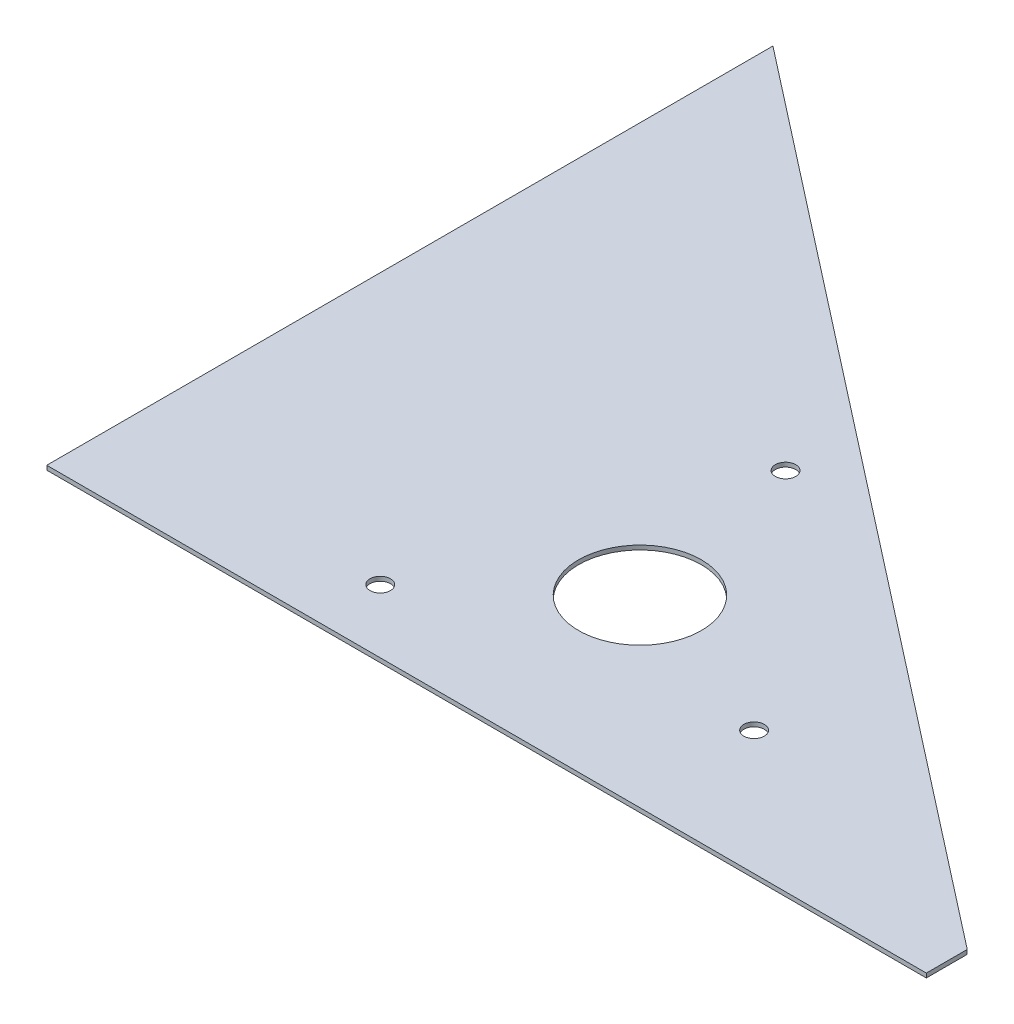
ISO-10303-21;
HEADER;
FILE_DESCRIPTION(('STEP AP214'),'2;1');
FILE_NAME('part.step','',(''),(''),'','','');
FILE_SCHEMA(('AUTOMOTIVE_DESIGN { 1 0 10303 214 1 1 1 1 }'));
ENDSEC;
DATA;
#1=APPLICATION_CONTEXT('core data for automotive mechanical design processes');
#2=APPLICATION_PROTOCOL_DEFINITION('international standard','automotive_design',2000,#1);
#3=PRODUCT_CONTEXT('',#1,'mechanical');
#4=PRODUCT('Part','Part','',(#3));
#5=PRODUCT_RELATED_PRODUCT_CATEGORY('part','',(#4));
#6=PRODUCT_DEFINITION_FORMATION('','',#4);
#7=PRODUCT_DEFINITION_CONTEXT('part definition',#1,'design');
#8=PRODUCT_DEFINITION('design','',#6,#7);
#9=PRODUCT_DEFINITION_SHAPE('','',#8);
#10=(LENGTH_UNIT() NAMED_UNIT(*) SI_UNIT(.MILLI.,.METRE.));
#11=(NAMED_UNIT(*) PLANE_ANGLE_UNIT() SI_UNIT($,.RADIAN.));
#12=(NAMED_UNIT(*) SI_UNIT($,.STERADIAN.) SOLID_ANGLE_UNIT());
#13=UNCERTAINTY_MEASURE_WITH_UNIT(LENGTH_MEASURE(1.E-05),#10,'distance_accuracy_value','');
#14=(GEOMETRIC_REPRESENTATION_CONTEXT(3) GLOBAL_UNCERTAINTY_ASSIGNED_CONTEXT((#13)) GLOBAL_UNIT_ASSIGNED_CONTEXT((#10,
#11,#12)) REPRESENTATION_CONTEXT('',''));
#15=CARTESIAN_POINT('',(0.,0.,0.));
#16=DIRECTION('',(0.,0.,1.));
#17=DIRECTION('',(1.,0.,0.));
#18=AXIS2_PLACEMENT_3D('',#15,#16,#17);
#19=CARTESIAN_POINT('',(546.1,2.65684,-25.4));
#20=DIRECTION('',(-0.614575452616154,0.,0.788858043656556));
#21=DIRECTION('',(0.788858043656556,0.,0.614575452616154));
#22=AXIS2_PLACEMENT_3D('',#19,#20,#21);
#23=PLANE('',#22);
#24=DIRECTION('',(-0.788858043656556,0.,-0.614575452616154));
#25=VECTOR('',#24,1.);
#26=CARTESIAN_POINT('',(546.1,0.,-25.4));
#27=LINE('',#26,#25);
#28=CARTESIAN_POINT('',(546.1,0.,-25.4));
#29=VERTEX_POINT('',#28);
#30=CARTESIAN_POINT('',(0.,0.,-450.85));
#31=VERTEX_POINT('',#30);
#32=EDGE_CURVE('E95',#29,#31,#27,.T.);
#33=ORIENTED_EDGE('',*,*,#32,.T.);
#34=DIRECTION('',(0.,-1.,0.));
#35=VECTOR('',#34,1.);
#36=CARTESIAN_POINT('',(0.,2.65684,-450.85));
#37=LINE('',#36,#35);
#38=CARTESIAN_POINT('',(0.,2.65684,-450.85));
#39=VERTEX_POINT('',#38);
#40=EDGE_CURVE('E11',#39,#31,#37,.T.);
#41=ORIENTED_EDGE('',*,*,#40,.F.);
#42=DIRECTION('',(-0.788858043656556,0.,-0.614575452616154));
#43=VECTOR('',#42,1.);
#44=CARTESIAN_POINT('',(546.1,2.65684,-25.4));
#45=LINE('',#44,#43);
#46=CARTESIAN_POINT('',(546.1,2.65684,-25.4));
#47=VERTEX_POINT('',#46);
#48=EDGE_CURVE('E83',#47,#39,#45,.T.);
#49=ORIENTED_EDGE('',*,*,#48,.F.);
#50=DIRECTION('',(0.,-1.,0.));
#51=VECTOR('',#50,1.);
#52=CARTESIAN_POINT('',(546.1,2.65684,-25.4));
#53=LINE('',#52,#51);
#54=EDGE_CURVE('E91',#47,#29,#53,.T.);
#55=ORIENTED_EDGE('',*,*,#54,.T.);
#56=EDGE_LOOP('',(#33,#41,#49,#55));
#57=FACE_BOUND('',#56,.T.);
#58=ADVANCED_FACE('F32',(#57),#23,.F.);
#59=CARTESIAN_POINT('',(0.,2.65684,-450.85));
#60=DIRECTION('',(1.,0.,0.));
#61=DIRECTION('',(0.,0.,-1.));
#62=AXIS2_PLACEMENT_3D('',#59,#60,#61);
#63=PLANE('',#62);
#64=DIRECTION('',(0.,0.,1.));
#65=VECTOR('',#64,1.);
#66=CARTESIAN_POINT('',(0.,0.,-450.85));
#67=LINE('',#66,#65);
#68=CARTESIAN_POINT('',(0.,0.,0.));
#69=VERTEX_POINT('',#68);
#70=EDGE_CURVE('E87',#31,#69,#67,.T.);
#71=ORIENTED_EDGE('',*,*,#70,.T.);
#72=DIRECTION('',(0.,-1.,0.));
#73=VECTOR('',#72,1.);
#74=CARTESIAN_POINT('',(0.,2.65684,0.));
#75=LINE('',#74,#73);
#76=CARTESIAN_POINT('',(0.,2.65684,0.));
#77=VERTEX_POINT('',#76);
#78=EDGE_CURVE('E40',#77,#69,#75,.T.);
#79=ORIENTED_EDGE('',*,*,#78,.F.);
#80=DIRECTION('',(0.,0.,1.));
#81=VECTOR('',#80,1.);
#82=CARTESIAN_POINT('',(0.,2.65684,-450.85));
#83=LINE('',#82,#81);
#84=EDGE_CURVE('E78',#39,#77,#83,.T.);
#85=ORIENTED_EDGE('',*,*,#84,.F.);
#86=ORIENTED_EDGE('',*,*,#40,.T.);
#87=EDGE_LOOP('',(#71,#79,#85,#86));
#88=FACE_BOUND('',#87,.T.);
#89=ADVANCED_FACE('F86',(#88),#63,.F.);
#90=CARTESIAN_POINT('',(0.,2.65684,0.));
#91=DIRECTION('',(0.,0.,-1.));
#92=DIRECTION('',(-1.,0.,0.));
#93=AXIS2_PLACEMENT_3D('',#90,#91,#92);
#94=PLANE('',#93);
#95=DIRECTION('',(1.,0.,0.));
#96=VECTOR('',#95,1.);
#97=CARTESIAN_POINT('',(0.,0.,0.));
#98=LINE('',#97,#96);
#99=CARTESIAN_POINT('',(546.1,0.,0.));
#100=VERTEX_POINT('',#99);
#101=EDGE_CURVE('E65',#69,#100,#98,.T.);
#102=ORIENTED_EDGE('',*,*,#101,.T.);
#103=DIRECTION('',(0.,-1.,0.));
#104=VECTOR('',#103,1.);
#105=CARTESIAN_POINT('',(546.1,2.65684,0.));
#106=LINE('',#105,#104);
#107=CARTESIAN_POINT('',(546.1,2.65684,0.));
#108=VERTEX_POINT('',#107);
#109=EDGE_CURVE('E88',#108,#100,#106,.T.);
#110=ORIENTED_EDGE('',*,*,#109,.F.);
#111=DIRECTION('',(1.,0.,0.));
#112=VECTOR('',#111,1.);
#113=CARTESIAN_POINT('',(0.,2.65684,0.));
#114=LINE('',#113,#112);
#115=EDGE_CURVE('E81',#77,#108,#114,.T.);
#116=ORIENTED_EDGE('',*,*,#115,.F.);
#117=ORIENTED_EDGE('',*,*,#78,.T.);
#118=EDGE_LOOP('',(#102,#110,#116,#117));
#119=FACE_BOUND('',#118,.T.);
#120=ADVANCED_FACE('F89',(#119),#94,.F.);
#121=CARTESIAN_POINT('',(546.1,2.65684,0.));
#122=DIRECTION('',(-1.,0.,0.));
#123=DIRECTION('',(0.,0.,1.));
#124=AXIS2_PLACEMENT_3D('',#121,#122,#123);
#125=PLANE('',#124);
#126=DIRECTION('',(0.,0.,-1.));
#127=VECTOR('',#126,1.);
#128=CARTESIAN_POINT('',(546.1,0.,0.));
#129=LINE('',#128,#127);
#130=EDGE_CURVE('E71',#100,#29,#129,.T.);
#131=ORIENTED_EDGE('',*,*,#130,.T.);
#132=ORIENTED_EDGE('',*,*,#54,.F.);
#133=DIRECTION('',(0.,0.,-1.));
#134=VECTOR('',#133,1.);
#135=CARTESIAN_POINT('',(546.1,2.65684,0.));
#136=LINE('',#135,#134);
#137=EDGE_CURVE('E48',#108,#47,#136,.T.);
#138=ORIENTED_EDGE('',*,*,#137,.F.);
#139=ORIENTED_EDGE('',*,*,#109,.T.);
#140=EDGE_LOOP('',(#131,#132,#138,#139));
#141=FACE_BOUND('',#140,.T.);
#142=ADVANCED_FACE('F103',(#141),#125,.F.);
#143=CARTESIAN_POINT('',(0.,2.65684,0.));
#144=DIRECTION('',(0.,1.,0.));
#145=DIRECTION('',(0.,0.,1.));
#146=AXIS2_PLACEMENT_3D('',#143,#144,#145);
#147=PLANE('',#146);
#148=CARTESIAN_POINT('',(232.190531828462,2.65684,-226.499987068068));
#149=DIRECTION('',(0.,1.,0.));
#150=DIRECTION('',(0.,0.,1.));
#151=AXIS2_PLACEMENT_3D('',#148,#149,#150);
#152=CIRCLE('',#151,6.34999999999998);
#153=CARTESIAN_POINT('',(232.190531828462,2.65684,-220.149987068068));
#154=VERTEX_POINT('',#153);
#155=EDGE_CURVE('E127',#154,#154,#152,.T.);
#156=ORIENTED_EDGE('',*,*,#155,.F.);
#157=EDGE_LOOP('',(#156));
#158=FACE_BOUND('',#157,.T.);
#159=CARTESIAN_POINT('',(167.736694980537,2.65684,-39.3124529863857));
#160=DIRECTION('',(0.,1.,0.));
#161=DIRECTION('',(0.,0.,1.));
#162=AXIS2_PLACEMENT_3D('',#159,#160,#161);
#163=CIRCLE('',#162,6.35000000000006);
#164=CARTESIAN_POINT('',(167.736694980537,2.65684,-32.9624529863856));
#165=VERTEX_POINT('',#164);
#166=EDGE_CURVE('E121',#165,#165,#163,.T.);
#167=ORIENTED_EDGE('',*,*,#166,.F.);
#168=EDGE_LOOP('',(#167));
#169=FACE_BOUND('',#168,.T.);
#170=CARTESIAN_POINT('',(362.072773191002,2.65684,-77.087559945547));
#171=DIRECTION('',(0.,1.,0.));
#172=DIRECTION('',(0.,0.,1.));
#173=AXIS2_PLACEMENT_3D('',#170,#171,#172);
#174=CIRCLE('',#173,6.35);
#175=CARTESIAN_POINT('',(362.072773191002,2.65684,-70.737559945547));
#176=VERTEX_POINT('',#175);
#177=EDGE_CURVE('E115',#176,#176,#174,.T.);
#178=ORIENTED_EDGE('',*,*,#177,.F.);
#179=EDGE_LOOP('',(#178));
#180=FACE_BOUND('',#179,.T.);
#181=CARTESIAN_POINT('',(254.,2.65684,-114.3));
#182=DIRECTION('',(0.,-1.,0.));
#183=DIRECTION('',(0.,0.,-1.));
#184=AXIS2_PLACEMENT_3D('',#181,#182,#183);
#185=CIRCLE('',#184,38.1);
#186=CARTESIAN_POINT('',(254.,2.65684,-152.4));
#187=VERTEX_POINT('',#186);
#188=EDGE_CURVE('E98',#187,#187,#185,.T.);
#189=ORIENTED_EDGE('',*,*,#188,.T.);
#190=EDGE_LOOP('',(#189));
#191=FACE_BOUND('',#190,.T.);
#192=ORIENTED_EDGE('',*,*,#48,.T.);
#193=ORIENTED_EDGE('',*,*,#84,.T.);
#194=ORIENTED_EDGE('',*,*,#115,.T.);
#195=ORIENTED_EDGE('',*,*,#137,.T.);
#196=EDGE_LOOP('',(#192,#193,#194,#195));
#197=FACE_BOUND('',#196,.T.);
#198=ADVANCED_FACE('F79',(#158,#169,#180,#191,#197),#147,.T.);
#199=CARTESIAN_POINT('',(0.,0.,0.));
#200=DIRECTION('',(0.,1.,0.));
#201=DIRECTION('',(0.,0.,1.));
#202=AXIS2_PLACEMENT_3D('',#199,#200,#201);
#203=PLANE('',#202);
#204=CARTESIAN_POINT('',(232.190531828462,0.,-226.499987068068));
#205=DIRECTION('',(0.,1.,0.));
#206=DIRECTION('',(0.,0.,1.));
#207=AXIS2_PLACEMENT_3D('',#204,#205,#206);
#208=CIRCLE('',#207,6.34999999999998);
#209=CARTESIAN_POINT('',(232.190531828462,0.,-220.149987068068));
#210=VERTEX_POINT('',#209);
#211=EDGE_CURVE('E124',#210,#210,#208,.T.);
#212=ORIENTED_EDGE('',*,*,#211,.T.);
#213=EDGE_LOOP('',(#212));
#214=FACE_BOUND('',#213,.T.);
#215=CARTESIAN_POINT('',(167.736694980537,0.,-39.3124529863857));
#216=DIRECTION('',(0.,1.,0.));
#217=DIRECTION('',(0.,0.,1.));
#218=AXIS2_PLACEMENT_3D('',#215,#216,#217);
#219=CIRCLE('',#218,6.35000000000006);
#220=CARTESIAN_POINT('',(167.736694980537,0.,-32.9624529863856));
#221=VERTEX_POINT('',#220);
#222=EDGE_CURVE('E118',#221,#221,#219,.T.);
#223=ORIENTED_EDGE('',*,*,#222,.T.);
#224=EDGE_LOOP('',(#223));
#225=FACE_BOUND('',#224,.T.);
#226=CARTESIAN_POINT('',(362.072773191002,0.,-77.087559945547));
#227=DIRECTION('',(0.,1.,0.));
#228=DIRECTION('',(0.,0.,1.));
#229=AXIS2_PLACEMENT_3D('',#226,#227,#228);
#230=CIRCLE('',#229,6.35);
#231=CARTESIAN_POINT('',(362.072773191002,0.,-70.737559945547));
#232=VERTEX_POINT('',#231);
#233=EDGE_CURVE('E112',#232,#232,#230,.T.);
#234=ORIENTED_EDGE('',*,*,#233,.T.);
#235=EDGE_LOOP('',(#234));
#236=FACE_BOUND('',#235,.T.);
#237=CARTESIAN_POINT('',(254.,0.,-114.3));
#238=DIRECTION('',(0.,-1.,0.));
#239=DIRECTION('',(0.,0.,-1.));
#240=AXIS2_PLACEMENT_3D('',#237,#238,#239);
#241=CIRCLE('',#240,38.1);
#242=CARTESIAN_POINT('',(254.,0.,-152.4));
#243=VERTEX_POINT('',#242);
#244=EDGE_CURVE('E109',#243,#243,#241,.T.);
#245=ORIENTED_EDGE('',*,*,#244,.F.);
#246=EDGE_LOOP('',(#245));
#247=FACE_BOUND('',#246,.T.);
#248=ORIENTED_EDGE('',*,*,#32,.F.);
#249=ORIENTED_EDGE('',*,*,#130,.F.);
#250=ORIENTED_EDGE('',*,*,#101,.F.);
#251=ORIENTED_EDGE('',*,*,#70,.F.);
#252=EDGE_LOOP('',(#248,#249,#250,#251));
#253=FACE_BOUND('',#252,.T.);
#254=ADVANCED_FACE('F106',(#214,#225,#236,#247,#253),#203,.F.);
#255=CARTESIAN_POINT('',(254.,2.65684,-114.3));
#256=DIRECTION('',(0.,-1.,0.));
#257=DIRECTION('',(0.,0.,-1.));
#258=AXIS2_PLACEMENT_3D('',#255,#256,#257);
#259=CYLINDRICAL_SURFACE('',#258,38.1);
#260=CARTESIAN_POINT('',(254.,2.65684,-152.4));
#261=CARTESIAN_POINT('',(254.,2.62916458333333,-152.4));
#262=CARTESIAN_POINT('',(254.,2.60148916666667,-152.4));
#263=CARTESIAN_POINT('',(254.,2.54613833333333,-152.4));
#264=CARTESIAN_POINT('',(254.,2.51846291666667,-152.4));
#265=CARTESIAN_POINT('',(254.,2.46311208333333,-152.4));
#266=CARTESIAN_POINT('',(254.,2.43543666666667,-152.4));
#267=CARTESIAN_POINT('',(254.,2.38008583333333,-152.4));
#268=CARTESIAN_POINT('',(254.,2.35241041666667,-152.4));
#269=CARTESIAN_POINT('',(254.,2.29705958333333,-152.4));
#270=CARTESIAN_POINT('',(254.,2.26938416666667,-152.4));
#271=CARTESIAN_POINT('',(254.,2.21403333333333,-152.4));
#272=CARTESIAN_POINT('',(254.,2.18635791666667,-152.4));
#273=CARTESIAN_POINT('',(254.,2.13100708333333,-152.4));
#274=CARTESIAN_POINT('',(254.,2.10333166666667,-152.4));
#275=CARTESIAN_POINT('',(254.,2.04798083333333,-152.4));
#276=CARTESIAN_POINT('',(254.,2.02030541666667,-152.4));
#277=CARTESIAN_POINT('',(254.,1.96495458333333,-152.4));
#278=CARTESIAN_POINT('',(254.,1.93727916666667,-152.4));
#279=CARTESIAN_POINT('',(254.,1.88192833333333,-152.4));
#280=CARTESIAN_POINT('',(254.,1.85425291666667,-152.4));
#281=CARTESIAN_POINT('',(254.,1.79890208333333,-152.4));
#282=CARTESIAN_POINT('',(254.,1.77122666666667,-152.4));
#283=CARTESIAN_POINT('',(254.,1.71587583333333,-152.4));
#284=CARTESIAN_POINT('',(254.,1.68820041666667,-152.4));
#285=CARTESIAN_POINT('',(254.,1.63284958333333,-152.4));
#286=CARTESIAN_POINT('',(254.,1.60517416666667,-152.4));
#287=CARTESIAN_POINT('',(254.,1.54982333333333,-152.4));
#288=CARTESIAN_POINT('',(254.,1.52214791666667,-152.4));
#289=CARTESIAN_POINT('',(254.,1.46679708333333,-152.4));
#290=CARTESIAN_POINT('',(254.,1.43912166666667,-152.4));
#291=CARTESIAN_POINT('',(254.,1.38377083333333,-152.4));
#292=CARTESIAN_POINT('',(254.,1.35609541666667,-152.4));
#293=CARTESIAN_POINT('',(254.,1.30074458333333,-152.4));
#294=CARTESIAN_POINT('',(254.,1.27306916666667,-152.4));
#295=CARTESIAN_POINT('',(254.,1.21771833333333,-152.4));
#296=CARTESIAN_POINT('',(254.,1.19004291666667,-152.4));
#297=CARTESIAN_POINT('',(254.,1.13469208333333,-152.4));
#298=CARTESIAN_POINT('',(254.,1.10701666666667,-152.4));
#299=CARTESIAN_POINT('',(254.,1.05166583333333,-152.4));
#300=CARTESIAN_POINT('',(254.,1.02399041666667,-152.4));
#301=CARTESIAN_POINT('',(254.,0.968639583333333,-152.4));
#302=CARTESIAN_POINT('',(254.,0.940964166666667,-152.4));
#303=CARTESIAN_POINT('',(254.,0.885613333333333,-152.4));
#304=CARTESIAN_POINT('',(254.,0.857937916666667,-152.4));
#305=CARTESIAN_POINT('',(254.,0.802587083333333,-152.4));
#306=CARTESIAN_POINT('',(254.,0.774911666666667,-152.4));
#307=CARTESIAN_POINT('',(254.,0.719560833333334,-152.4));
#308=CARTESIAN_POINT('',(254.,0.691885416666667,-152.4));
#309=CARTESIAN_POINT('',(254.,0.636534583333334,-152.4));
#310=CARTESIAN_POINT('',(254.,0.608859166666667,-152.4));
#311=CARTESIAN_POINT('',(254.,0.553508333333334,-152.4));
#312=CARTESIAN_POINT('',(254.,0.525832916666667,-152.4));
#313=CARTESIAN_POINT('',(254.,0.470482083333334,-152.4));
#314=CARTESIAN_POINT('',(254.,0.442806666666667,-152.4));
#315=CARTESIAN_POINT('',(254.,0.387455833333334,-152.4));
#316=CARTESIAN_POINT('',(254.,0.359780416666667,-152.4));
#317=CARTESIAN_POINT('',(254.,0.304429583333334,-152.4));
#318=CARTESIAN_POINT('',(254.,0.276754166666667,-152.4));
#319=CARTESIAN_POINT('',(254.,0.221403333333334,-152.4));
#320=CARTESIAN_POINT('',(254.,0.193727916666667,-152.4));
#321=CARTESIAN_POINT('',(254.,0.138377083333334,-152.4));
#322=CARTESIAN_POINT('',(254.,0.110701666666667,-152.4));
#323=CARTESIAN_POINT('',(254.,0.0553508333333336,-152.4));
#324=CARTESIAN_POINT('',(254.,0.027675416666667,-152.4));
#325=CARTESIAN_POINT('',(254.,0.,-152.4));
#326=B_SPLINE_CURVE_WITH_KNOTS('',3,(#260,#261,#262,#263,#264,#265,#266,#267,#268,#269,#270,
#271,#272,#273,#274,#275,#276,#277,#278,#279,#280,#281,#282,#283,#284,#285,#286,#287,#288,#289,
#290,#291,#292,#293,#294,#295,#296,#297,#298,#299,#300,#301,#302,#303,#304,#305,#306,#307,#308,
#309,#310,#311,#312,#313,#314,#315,#316,#317,#318,#319,#320,#321,#322,#323,#324,#325),
.UNSPECIFIED.,.F.,.F.,(4,2,2,2,2,2,2,2,2,2,2,2,2,2,2,2,2,2,2,2,2,2,2,2,2,2,2,2,2,2,2,2,4),(0.,
0.0830262500000002,0.1660525,0.24907875,0.332105,0.41513125,0.4981575,0.58118375,0.66421,
0.74723625,0.8302625,0.91328875,0.996315,1.07934125,1.1623675,1.24539375,1.32842,1.41144625,
1.4944725,1.57749875,1.660525,1.74355125,1.8265775,1.90960375,1.99263,2.07565625,2.1586825,
2.24170875,2.324735,2.40776125,2.4907875,2.57381375,2.65684),.UNSPECIFIED.);
#327=EDGE_CURVE('BSEAM151',#187,#243,#326,.T.);
#328=ORIENTED_EDGE('',*,*,#188,.F.);
#329=ORIENTED_EDGE('',*,*,#244,.T.);
#330=ORIENTED_EDGE('',*,*,#327,.T.);
#331=ORIENTED_EDGE('',*,*,#327,.F.);
#332=EDGE_LOOP('',(#328,#330,#329,#331));
#333=FACE_BOUND('',#332,.T.);
#334=ADVANCED_FACE('F151',(#333),#259,.F.);
#335=CARTESIAN_POINT('',(362.072773191002,0.,-77.087559945547));
#336=DIRECTION('',(0.,1.,0.));
#337=DIRECTION('',(0.,0.,1.));
#338=AXIS2_PLACEMENT_3D('',#335,#336,#337);
#339=CYLINDRICAL_SURFACE('',#338,6.35);
#340=CARTESIAN_POINT('',(362.072773191002,0.,-70.737559945547));
#341=CARTESIAN_POINT('',(362.072773191002,0.0276754166666666,-70.737559945547));
#342=CARTESIAN_POINT('',(362.072773191002,0.0553508333333333,-70.737559945547));
#343=CARTESIAN_POINT('',(362.072773191002,0.110701666666667,-70.737559945547));
#344=CARTESIAN_POINT('',(362.072773191002,0.138377083333333,-70.737559945547));
#345=CARTESIAN_POINT('',(362.072773191002,0.193727916666667,-70.737559945547));
#346=CARTESIAN_POINT('',(362.072773191002,0.221403333333333,-70.737559945547));
#347=CARTESIAN_POINT('',(362.072773191002,0.276754166666667,-70.737559945547));
#348=CARTESIAN_POINT('',(362.072773191002,0.304429583333333,-70.737559945547));
#349=CARTESIAN_POINT('',(362.072773191002,0.359780416666667,-70.737559945547));
#350=CARTESIAN_POINT('',(362.072773191002,0.387455833333333,-70.737559945547));
#351=CARTESIAN_POINT('',(362.072773191002,0.442806666666667,-70.737559945547));
#352=CARTESIAN_POINT('',(362.072773191002,0.470482083333333,-70.737559945547));
#353=CARTESIAN_POINT('',(362.072773191002,0.525832916666666,-70.737559945547));
#354=CARTESIAN_POINT('',(362.072773191002,0.553508333333333,-70.737559945547));
#355=CARTESIAN_POINT('',(362.072773191002,0.608859166666667,-70.737559945547));
#356=CARTESIAN_POINT('',(362.072773191002,0.636534583333333,-70.737559945547));
#357=CARTESIAN_POINT('',(362.072773191002,0.691885416666666,-70.737559945547));
#358=CARTESIAN_POINT('',(362.072773191002,0.719560833333333,-70.737559945547));
#359=CARTESIAN_POINT('',(362.072773191002,0.774911666666667,-70.737559945547));
#360=CARTESIAN_POINT('',(362.072773191002,0.802587083333333,-70.737559945547));
#361=CARTESIAN_POINT('',(362.072773191002,0.857937916666667,-70.737559945547));
#362=CARTESIAN_POINT('',(362.072773191002,0.885613333333333,-70.737559945547));
#363=CARTESIAN_POINT('',(362.072773191002,0.940964166666666,-70.737559945547));
#364=CARTESIAN_POINT('',(362.072773191002,0.968639583333333,-70.737559945547));
#365=CARTESIAN_POINT('',(362.072773191002,1.02399041666667,-70.737559945547));
#366=CARTESIAN_POINT('',(362.072773191002,1.05166583333333,-70.737559945547));
#367=CARTESIAN_POINT('',(362.072773191002,1.10701666666667,-70.737559945547));
#368=CARTESIAN_POINT('',(362.072773191002,1.13469208333333,-70.737559945547));
#369=CARTESIAN_POINT('',(362.072773191002,1.19004291666667,-70.737559945547));
#370=CARTESIAN_POINT('',(362.072773191002,1.21771833333333,-70.737559945547));
#371=CARTESIAN_POINT('',(362.072773191002,1.27306916666667,-70.737559945547));
#372=CARTESIAN_POINT('',(362.072773191002,1.30074458333333,-70.737559945547));
#373=CARTESIAN_POINT('',(362.072773191002,1.35609541666667,-70.737559945547));
#374=CARTESIAN_POINT('',(362.072773191002,1.38377083333333,-70.737559945547));
#375=CARTESIAN_POINT('',(362.072773191002,1.43912166666667,-70.737559945547));
#376=CARTESIAN_POINT('',(362.072773191002,1.46679708333333,-70.737559945547));
#377=CARTESIAN_POINT('',(362.072773191002,1.52214791666667,-70.737559945547));
#378=CARTESIAN_POINT('',(362.072773191002,1.54982333333333,-70.737559945547));
#379=CARTESIAN_POINT('',(362.072773191002,1.60517416666667,-70.737559945547));
#380=CARTESIAN_POINT('',(362.072773191002,1.63284958333333,-70.737559945547));
#381=CARTESIAN_POINT('',(362.072773191002,1.68820041666667,-70.737559945547));
#382=CARTESIAN_POINT('',(362.072773191002,1.71587583333333,-70.737559945547));
#383=CARTESIAN_POINT('',(362.072773191002,1.77122666666667,-70.737559945547));
#384=CARTESIAN_POINT('',(362.072773191002,1.79890208333333,-70.737559945547));
#385=CARTESIAN_POINT('',(362.072773191002,1.85425291666667,-70.737559945547));
#386=CARTESIAN_POINT('',(362.072773191002,1.88192833333333,-70.737559945547));
#387=CARTESIAN_POINT('',(362.072773191002,1.93727916666667,-70.737559945547));
#388=CARTESIAN_POINT('',(362.072773191002,1.96495458333333,-70.737559945547));
#389=CARTESIAN_POINT('',(362.072773191002,2.02030541666667,-70.737559945547));
#390=CARTESIAN_POINT('',(362.072773191002,2.04798083333333,-70.737559945547));
#391=CARTESIAN_POINT('',(362.072773191002,2.10333166666667,-70.737559945547));
#392=CARTESIAN_POINT('',(362.072773191002,2.13100708333333,-70.737559945547));
#393=CARTESIAN_POINT('',(362.072773191002,2.18635791666667,-70.737559945547));
#394=CARTESIAN_POINT('',(362.072773191002,2.21403333333333,-70.737559945547));
#395=CARTESIAN_POINT('',(362.072773191002,2.26938416666667,-70.737559945547));
#396=CARTESIAN_POINT('',(362.072773191002,2.29705958333333,-70.737559945547));
#397=CARTESIAN_POINT('',(362.072773191002,2.35241041666667,-70.737559945547));
#398=CARTESIAN_POINT('',(362.072773191002,2.38008583333333,-70.737559945547));
#399=CARTESIAN_POINT('',(362.072773191002,2.43543666666667,-70.737559945547));
#400=CARTESIAN_POINT('',(362.072773191002,2.46311208333333,-70.737559945547));
#401=CARTESIAN_POINT('',(362.072773191002,2.51846291666667,-70.737559945547));
#402=CARTESIAN_POINT('',(362.072773191002,2.54613833333333,-70.737559945547));
#403=CARTESIAN_POINT('',(362.072773191002,2.60148916666667,-70.737559945547));
#404=CARTESIAN_POINT('',(362.072773191002,2.62916458333333,-70.737559945547));
#405=CARTESIAN_POINT('',(362.072773191002,2.65684,-70.737559945547));
#406=B_SPLINE_CURVE_WITH_KNOTS('',3,(#340,#341,#342,#343,#344,#345,#346,#347,#348,#349,#350,
#351,#352,#353,#354,#355,#356,#357,#358,#359,#360,#361,#362,#363,#364,#365,#366,#367,#368,#369,
#370,#371,#372,#373,#374,#375,#376,#377,#378,#379,#380,#381,#382,#383,#384,#385,#386,#387,#388,
#389,#390,#391,#392,#393,#394,#395,#396,#397,#398,#399,#400,#401,#402,#403,#404,#405),
.UNSPECIFIED.,.F.,.F.,(4,2,2,2,2,2,2,2,2,2,2,2,2,2,2,2,2,2,2,2,2,2,2,2,2,2,2,2,2,2,2,2,4),(0.,
0.08302625,0.1660525,0.24907875,0.332105,0.41513125,0.4981575,0.58118375,0.66421,0.74723625,
0.8302625,0.91328875,0.996315,1.07934125,1.1623675,1.24539375,1.32842,1.41144625,1.4944725,
1.57749875,1.660525,1.74355125,1.8265775,1.90960375,1.99263,2.07565625,2.1586825,2.24170875,
2.324735,2.40776125,2.4907875,2.57381375,2.65684),.UNSPECIFIED.);
#407=EDGE_CURVE('BSEAM154',#232,#176,#406,.T.);
#408=ORIENTED_EDGE('',*,*,#233,.F.);
#409=ORIENTED_EDGE('',*,*,#177,.T.);
#410=ORIENTED_EDGE('',*,*,#407,.T.);
#411=ORIENTED_EDGE('',*,*,#407,.F.);
#412=EDGE_LOOP('',(#408,#410,#409,#411));
#413=FACE_BOUND('',#412,.T.);
#414=ADVANCED_FACE('F154',(#413),#339,.F.);
#415=CARTESIAN_POINT('',(167.736694980537,0.,-39.3124529863857));
#416=DIRECTION('',(0.,1.,0.));
#417=DIRECTION('',(0.,0.,1.));
#418=AXIS2_PLACEMENT_3D('',#415,#416,#417);
#419=CYLINDRICAL_SURFACE('',#418,6.35000000000006);
#420=CARTESIAN_POINT('',(167.736694980537,0.,-32.9624529863856));
#421=CARTESIAN_POINT('',(167.736694980537,0.0276754166666666,-32.9624529863856));
#422=CARTESIAN_POINT('',(167.736694980537,0.0553508333333333,-32.9624529863856));
#423=CARTESIAN_POINT('',(167.736694980537,0.110701666666667,-32.9624529863856));
#424=CARTESIAN_POINT('',(167.736694980537,0.138377083333333,-32.9624529863856));
#425=CARTESIAN_POINT('',(167.736694980537,0.193727916666667,-32.9624529863856));
#426=CARTESIAN_POINT('',(167.736694980537,0.221403333333333,-32.9624529863856));
#427=CARTESIAN_POINT('',(167.736694980537,0.276754166666667,-32.9624529863856));
#428=CARTESIAN_POINT('',(167.736694980537,0.304429583333333,-32.9624529863856));
#429=CARTESIAN_POINT('',(167.736694980537,0.359780416666667,-32.9624529863856));
#430=CARTESIAN_POINT('',(167.736694980537,0.387455833333333,-32.9624529863856));
#431=CARTESIAN_POINT('',(167.736694980537,0.442806666666667,-32.9624529863856));
#432=CARTESIAN_POINT('',(167.736694980537,0.470482083333333,-32.9624529863856));
#433=CARTESIAN_POINT('',(167.736694980537,0.525832916666666,-32.9624529863856));
#434=CARTESIAN_POINT('',(167.736694980537,0.553508333333333,-32.9624529863856));
#435=CARTESIAN_POINT('',(167.736694980537,0.608859166666667,-32.9624529863856));
#436=CARTESIAN_POINT('',(167.736694980537,0.636534583333333,-32.9624529863856));
#437=CARTESIAN_POINT('',(167.736694980537,0.691885416666666,-32.9624529863856));
#438=CARTESIAN_POINT('',(167.736694980537,0.719560833333333,-32.9624529863856));
#439=CARTESIAN_POINT('',(167.736694980537,0.774911666666667,-32.9624529863856));
#440=CARTESIAN_POINT('',(167.736694980537,0.802587083333333,-32.9624529863856));
#441=CARTESIAN_POINT('',(167.736694980537,0.857937916666667,-32.9624529863856));
#442=CARTESIAN_POINT('',(167.736694980537,0.885613333333333,-32.9624529863856));
#443=CARTESIAN_POINT('',(167.736694980537,0.940964166666666,-32.9624529863856));
#444=CARTESIAN_POINT('',(167.736694980537,0.968639583333333,-32.9624529863856));
#445=CARTESIAN_POINT('',(167.736694980537,1.02399041666667,-32.9624529863856));
#446=CARTESIAN_POINT('',(167.736694980537,1.05166583333333,-32.9624529863856));
#447=CARTESIAN_POINT('',(167.736694980537,1.10701666666667,-32.9624529863856));
#448=CARTESIAN_POINT('',(167.736694980537,1.13469208333333,-32.9624529863856));
#449=CARTESIAN_POINT('',(167.736694980537,1.19004291666667,-32.9624529863856));
#450=CARTESIAN_POINT('',(167.736694980537,1.21771833333333,-32.9624529863856));
#451=CARTESIAN_POINT('',(167.736694980537,1.27306916666667,-32.9624529863856));
#452=CARTESIAN_POINT('',(167.736694980537,1.30074458333333,-32.9624529863856));
#453=CARTESIAN_POINT('',(167.736694980537,1.35609541666667,-32.9624529863856));
#454=CARTESIAN_POINT('',(167.736694980537,1.38377083333333,-32.9624529863856));
#455=CARTESIAN_POINT('',(167.736694980537,1.43912166666667,-32.9624529863856));
#456=CARTESIAN_POINT('',(167.736694980537,1.46679708333333,-32.9624529863856));
#457=CARTESIAN_POINT('',(167.736694980537,1.52214791666667,-32.9624529863856));
#458=CARTESIAN_POINT('',(167.736694980537,1.54982333333333,-32.9624529863856));
#459=CARTESIAN_POINT('',(167.736694980537,1.60517416666667,-32.9624529863856));
#460=CARTESIAN_POINT('',(167.736694980537,1.63284958333333,-32.9624529863856));
#461=CARTESIAN_POINT('',(167.736694980537,1.68820041666667,-32.9624529863856));
#462=CARTESIAN_POINT('',(167.736694980537,1.71587583333333,-32.9624529863856));
#463=CARTESIAN_POINT('',(167.736694980537,1.77122666666667,-32.9624529863856));
#464=CARTESIAN_POINT('',(167.736694980537,1.79890208333333,-32.9624529863856));
#465=CARTESIAN_POINT('',(167.736694980537,1.85425291666667,-32.9624529863856));
#466=CARTESIAN_POINT('',(167.736694980537,1.88192833333333,-32.9624529863856));
#467=CARTESIAN_POINT('',(167.736694980537,1.93727916666667,-32.9624529863856));
#468=CARTESIAN_POINT('',(167.736694980537,1.96495458333333,-32.9624529863856));
#469=CARTESIAN_POINT('',(167.736694980537,2.02030541666667,-32.9624529863856));
#470=CARTESIAN_POINT('',(167.736694980537,2.04798083333333,-32.9624529863856));
#471=CARTESIAN_POINT('',(167.736694980537,2.10333166666667,-32.9624529863856));
#472=CARTESIAN_POINT('',(167.736694980537,2.13100708333333,-32.9624529863856));
#473=CARTESIAN_POINT('',(167.736694980537,2.18635791666667,-32.9624529863856));
#474=CARTESIAN_POINT('',(167.736694980537,2.21403333333333,-32.9624529863856));
#475=CARTESIAN_POINT('',(167.736694980537,2.26938416666667,-32.9624529863856));
#476=CARTESIAN_POINT('',(167.736694980537,2.29705958333333,-32.9624529863856));
#477=CARTESIAN_POINT('',(167.736694980537,2.35241041666667,-32.9624529863856));
#478=CARTESIAN_POINT('',(167.736694980537,2.38008583333333,-32.9624529863856));
#479=CARTESIAN_POINT('',(167.736694980537,2.43543666666667,-32.9624529863856));
#480=CARTESIAN_POINT('',(167.736694980537,2.46311208333333,-32.9624529863856));
#481=CARTESIAN_POINT('',(167.736694980537,2.51846291666667,-32.9624529863856));
#482=CARTESIAN_POINT('',(167.736694980537,2.54613833333333,-32.9624529863856));
#483=CARTESIAN_POINT('',(167.736694980537,2.60148916666667,-32.9624529863856));
#484=CARTESIAN_POINT('',(167.736694980537,2.62916458333333,-32.9624529863856));
#485=CARTESIAN_POINT('',(167.736694980537,2.65684,-32.9624529863856));
#486=B_SPLINE_CURVE_WITH_KNOTS('',3,(#420,#421,#422,#423,#424,#425,#426,#427,#428,#429,#430,
#431,#432,#433,#434,#435,#436,#437,#438,#439,#440,#441,#442,#443,#444,#445,#446,#447,#448,#449,
#450,#451,#452,#453,#454,#455,#456,#457,#458,#459,#460,#461,#462,#463,#464,#465,#466,#467,#468,
#469,#470,#471,#472,#473,#474,#475,#476,#477,#478,#479,#480,#481,#482,#483,#484,#485),
.UNSPECIFIED.,.F.,.F.,(4,2,2,2,2,2,2,2,2,2,2,2,2,2,2,2,2,2,2,2,2,2,2,2,2,2,2,2,2,2,2,2,4),(0.,
0.08302625,0.1660525,0.24907875,0.332105,0.41513125,0.4981575,0.58118375,0.66421,0.74723625,
0.8302625,0.91328875,0.996315,1.07934125,1.1623675,1.24539375,1.32842,1.41144625,1.4944725,
1.57749875,1.660525,1.74355125,1.8265775,1.90960375,1.99263,2.07565625,2.1586825,2.24170875,
2.324735,2.40776125,2.4907875,2.57381375,2.65684),.UNSPECIFIED.);
#487=EDGE_CURVE('BSEAM138',#221,#165,#486,.T.);
#488=ORIENTED_EDGE('',*,*,#222,.F.);
#489=ORIENTED_EDGE('',*,*,#166,.T.);
#490=ORIENTED_EDGE('',*,*,#487,.T.);
#491=ORIENTED_EDGE('',*,*,#487,.F.);
#492=EDGE_LOOP('',(#488,#490,#489,#491));
#493=FACE_BOUND('',#492,.T.);
#494=ADVANCED_FACE('F138',(#493),#419,.F.);
#495=CARTESIAN_POINT('',(232.190531828462,0.,-226.499987068068));
#496=DIRECTION('',(0.,1.,0.));
#497=DIRECTION('',(0.,0.,1.));
#498=AXIS2_PLACEMENT_3D('',#495,#496,#497);
#499=CYLINDRICAL_SURFACE('',#498,6.34999999999998);
#500=CARTESIAN_POINT('',(232.190531828462,0.,-220.149987068068));
#501=CARTESIAN_POINT('',(232.190531828462,0.0276754166666666,-220.149987068068));
#502=CARTESIAN_POINT('',(232.190531828462,0.0553508333333333,-220.149987068068));
#503=CARTESIAN_POINT('',(232.190531828462,0.110701666666667,-220.149987068068));
#504=CARTESIAN_POINT('',(232.190531828462,0.138377083333333,-220.149987068068));
#505=CARTESIAN_POINT('',(232.190531828462,0.193727916666667,-220.149987068068));
#506=CARTESIAN_POINT('',(232.190531828462,0.221403333333333,-220.149987068068));
#507=CARTESIAN_POINT('',(232.190531828462,0.276754166666667,-220.149987068068));
#508=CARTESIAN_POINT('',(232.190531828462,0.304429583333333,-220.149987068068));
#509=CARTESIAN_POINT('',(232.190531828462,0.359780416666667,-220.149987068068));
#510=CARTESIAN_POINT('',(232.190531828462,0.387455833333333,-220.149987068068));
#511=CARTESIAN_POINT('',(232.190531828462,0.442806666666667,-220.149987068068));
#512=CARTESIAN_POINT('',(232.190531828462,0.470482083333333,-220.149987068068));
#513=CARTESIAN_POINT('',(232.190531828462,0.525832916666666,-220.149987068068));
#514=CARTESIAN_POINT('',(232.190531828462,0.553508333333333,-220.149987068068));
#515=CARTESIAN_POINT('',(232.190531828462,0.608859166666667,-220.149987068068));
#516=CARTESIAN_POINT('',(232.190531828462,0.636534583333333,-220.149987068068));
#517=CARTESIAN_POINT('',(232.190531828462,0.691885416666666,-220.149987068068));
#518=CARTESIAN_POINT('',(232.190531828462,0.719560833333333,-220.149987068068));
#519=CARTESIAN_POINT('',(232.190531828462,0.774911666666667,-220.149987068068));
#520=CARTESIAN_POINT('',(232.190531828462,0.802587083333333,-220.149987068068));
#521=CARTESIAN_POINT('',(232.190531828462,0.857937916666667,-220.149987068068));
#522=CARTESIAN_POINT('',(232.190531828462,0.885613333333333,-220.149987068068));
#523=CARTESIAN_POINT('',(232.190531828462,0.940964166666666,-220.149987068068));
#524=CARTESIAN_POINT('',(232.190531828462,0.968639583333333,-220.149987068068));
#525=CARTESIAN_POINT('',(232.190531828462,1.02399041666667,-220.149987068068));
#526=CARTESIAN_POINT('',(232.190531828462,1.05166583333333,-220.149987068068));
#527=CARTESIAN_POINT('',(232.190531828462,1.10701666666667,-220.149987068068));
#528=CARTESIAN_POINT('',(232.190531828462,1.13469208333333,-220.149987068068));
#529=CARTESIAN_POINT('',(232.190531828462,1.19004291666667,-220.149987068068));
#530=CARTESIAN_POINT('',(232.190531828462,1.21771833333333,-220.149987068068));
#531=CARTESIAN_POINT('',(232.190531828462,1.27306916666667,-220.149987068068));
#532=CARTESIAN_POINT('',(232.190531828462,1.30074458333333,-220.149987068068));
#533=CARTESIAN_POINT('',(232.190531828462,1.35609541666667,-220.149987068068));
#534=CARTESIAN_POINT('',(232.190531828462,1.38377083333333,-220.149987068068));
#535=CARTESIAN_POINT('',(232.190531828462,1.43912166666667,-220.149987068068));
#536=CARTESIAN_POINT('',(232.190531828462,1.46679708333333,-220.149987068068));
#537=CARTESIAN_POINT('',(232.190531828462,1.52214791666667,-220.149987068068));
#538=CARTESIAN_POINT('',(232.190531828462,1.54982333333333,-220.149987068068));
#539=CARTESIAN_POINT('',(232.190531828462,1.60517416666667,-220.149987068068));
#540=CARTESIAN_POINT('',(232.190531828462,1.63284958333333,-220.149987068068));
#541=CARTESIAN_POINT('',(232.190531828462,1.68820041666667,-220.149987068068));
#542=CARTESIAN_POINT('',(232.190531828462,1.71587583333333,-220.149987068068));
#543=CARTESIAN_POINT('',(232.190531828462,1.77122666666667,-220.149987068068));
#544=CARTESIAN_POINT('',(232.190531828462,1.79890208333333,-220.149987068068));
#545=CARTESIAN_POINT('',(232.190531828462,1.85425291666667,-220.149987068068));
#546=CARTESIAN_POINT('',(232.190531828462,1.88192833333333,-220.149987068068));
#547=CARTESIAN_POINT('',(232.190531828462,1.93727916666667,-220.149987068068));
#548=CARTESIAN_POINT('',(232.190531828462,1.96495458333333,-220.149987068068));
#549=CARTESIAN_POINT('',(232.190531828462,2.02030541666667,-220.149987068068));
#550=CARTESIAN_POINT('',(232.190531828462,2.04798083333333,-220.149987068068));
#551=CARTESIAN_POINT('',(232.190531828462,2.10333166666667,-220.149987068068));
#552=CARTESIAN_POINT('',(232.190531828462,2.13100708333333,-220.149987068068));
#553=CARTESIAN_POINT('',(232.190531828462,2.18635791666667,-220.149987068068));
#554=CARTESIAN_POINT('',(232.190531828462,2.21403333333333,-220.149987068068));
#555=CARTESIAN_POINT('',(232.190531828462,2.26938416666667,-220.149987068068));
#556=CARTESIAN_POINT('',(232.190531828462,2.29705958333333,-220.149987068068));
#557=CARTESIAN_POINT('',(232.190531828462,2.35241041666667,-220.149987068068));
#558=CARTESIAN_POINT('',(232.190531828462,2.38008583333333,-220.149987068068));
#559=CARTESIAN_POINT('',(232.190531828462,2.43543666666667,-220.149987068068));
#560=CARTESIAN_POINT('',(232.190531828462,2.46311208333333,-220.149987068068));
#561=CARTESIAN_POINT('',(232.190531828462,2.51846291666667,-220.149987068068));
#562=CARTESIAN_POINT('',(232.190531828462,2.54613833333333,-220.149987068068));
#563=CARTESIAN_POINT('',(232.190531828462,2.60148916666667,-220.149987068068));
#564=CARTESIAN_POINT('',(232.190531828462,2.62916458333333,-220.149987068068));
#565=CARTESIAN_POINT('',(232.190531828462,2.65684,-220.149987068068));
#566=B_SPLINE_CURVE_WITH_KNOTS('',3,(#500,#501,#502,#503,#504,#505,#506,#507,#508,#509,#510,
#511,#512,#513,#514,#515,#516,#517,#518,#519,#520,#521,#522,#523,#524,#525,#526,#527,#528,#529,
#530,#531,#532,#533,#534,#535,#536,#537,#538,#539,#540,#541,#542,#543,#544,#545,#546,#547,#548,
#549,#550,#551,#552,#553,#554,#555,#556,#557,#558,#559,#560,#561,#562,#563,#564,#565),
.UNSPECIFIED.,.F.,.F.,(4,2,2,2,2,2,2,2,2,2,2,2,2,2,2,2,2,2,2,2,2,2,2,2,2,2,2,2,2,2,2,2,4),(0.,
0.08302625,0.1660525,0.24907875,0.332105,0.41513125,0.4981575,0.58118375,0.66421,0.74723625,
0.8302625,0.91328875,0.996315,1.07934125,1.1623675,1.24539375,1.32842,1.41144625,1.4944725,
1.57749875,1.660525,1.74355125,1.8265775,1.90960375,1.99263,2.07565625,2.1586825,2.24170875,
2.324735,2.40776125,2.4907875,2.57381375,2.65684),.UNSPECIFIED.);
#567=EDGE_CURVE('BSEAM135',#210,#154,#566,.T.);
#568=ORIENTED_EDGE('',*,*,#211,.F.);
#569=ORIENTED_EDGE('',*,*,#155,.T.);
#570=ORIENTED_EDGE('',*,*,#567,.T.);
#571=ORIENTED_EDGE('',*,*,#567,.F.);
#572=EDGE_LOOP('',(#568,#570,#569,#571));
#573=FACE_BOUND('',#572,.T.);
#574=ADVANCED_FACE('F135',(#573),#499,.F.);
#575=CLOSED_SHELL('',(#58,#89,#120,#142,#198,#254,#334,#414,#494,#574));
#576=MANIFOLD_SOLID_BREP('B2',#575);
#577=ADVANCED_BREP_SHAPE_REPRESENTATION('',(#18,#576),#14);
#578=SHAPE_DEFINITION_REPRESENTATION(#9,#577);
ENDSEC;
END-ISO-10303-21;
